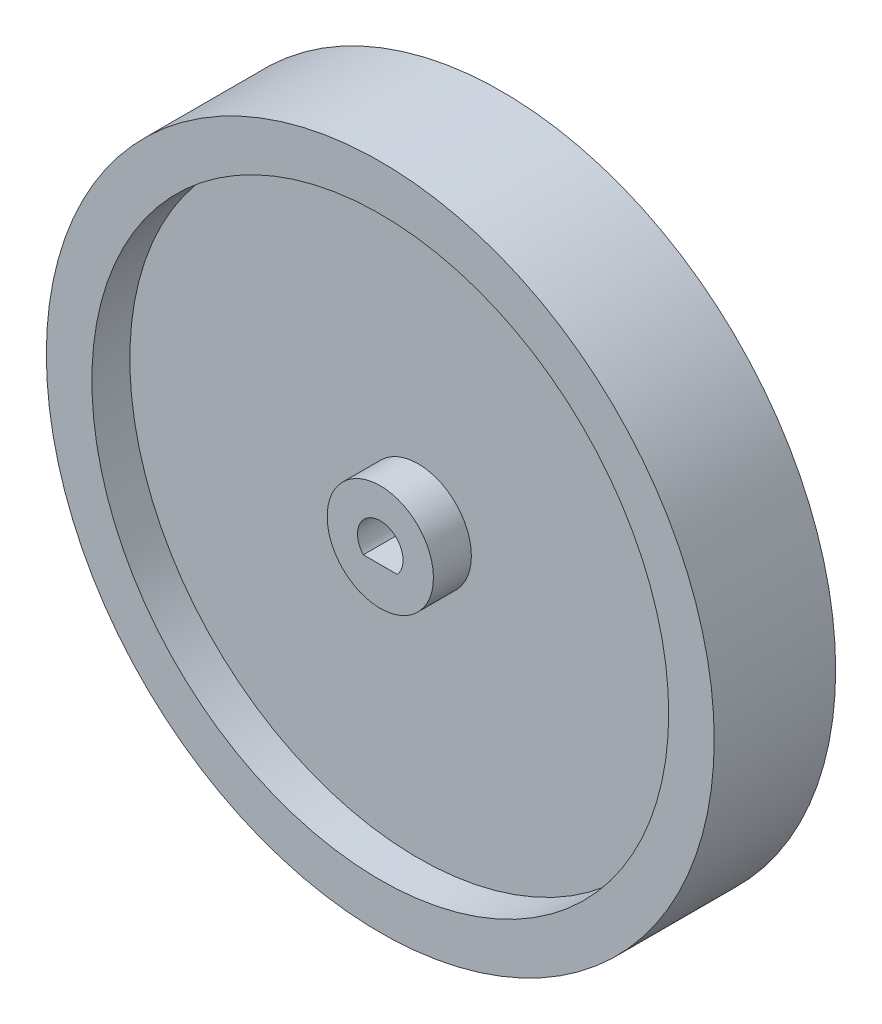
ISO-10303-21;
HEADER;
FILE_DESCRIPTION(('STEP AP214'),'2;1');
FILE_NAME('part.step','',(''),(''),'','','');
FILE_SCHEMA(('AUTOMOTIVE_DESIGN { 1 0 10303 214 1 1 1 1 }'));
ENDSEC;
DATA;
#1=APPLICATION_CONTEXT('core data for automotive mechanical design processes');
#2=APPLICATION_PROTOCOL_DEFINITION('international standard','automotive_design',2000,#1);
#3=PRODUCT_CONTEXT('',#1,'mechanical');
#4=PRODUCT('Part','Part','',(#3));
#5=PRODUCT_RELATED_PRODUCT_CATEGORY('part','',(#4));
#6=PRODUCT_DEFINITION_FORMATION('','',#4);
#7=PRODUCT_DEFINITION_CONTEXT('part definition',#1,'design');
#8=PRODUCT_DEFINITION('design','',#6,#7);
#9=PRODUCT_DEFINITION_SHAPE('','',#8);
#10=(LENGTH_UNIT() NAMED_UNIT(*) SI_UNIT(.MILLI.,.METRE.));
#11=(NAMED_UNIT(*) PLANE_ANGLE_UNIT() SI_UNIT($,.RADIAN.));
#12=(NAMED_UNIT(*) SI_UNIT($,.STERADIAN.) SOLID_ANGLE_UNIT());
#13=UNCERTAINTY_MEASURE_WITH_UNIT(LENGTH_MEASURE(1.E-05),#10,'distance_accuracy_value','');
#14=(GEOMETRIC_REPRESENTATION_CONTEXT(3) GLOBAL_UNCERTAINTY_ASSIGNED_CONTEXT((#13)) GLOBAL_UNIT_ASSIGNED_CONTEXT((#10,
#11,#12)) REPRESENTATION_CONTEXT('',''));
#15=CARTESIAN_POINT('',(0.,0.,0.));
#16=DIRECTION('',(0.,0.,1.));
#17=DIRECTION('',(1.,0.,0.));
#18=AXIS2_PLACEMENT_3D('',#15,#16,#17);
#19=CARTESIAN_POINT('',(0.,0.,-4.));
#20=DIRECTION('',(0.,0.,1.));
#21=DIRECTION('',(1.,0.,0.));
#22=AXIS2_PLACEMENT_3D('',#19,#20,#21);
#23=CYLINDRICAL_SURFACE('',#22,3.5);
#24=CARTESIAN_POINT('',(0.,0.,-4.));
#25=DIRECTION('',(0.,0.,1.));
#26=DIRECTION('',(1.,0.,0.));
#27=AXIS2_PLACEMENT_3D('',#24,#25,#26);
#28=CIRCLE('',#27,3.5);
#29=CARTESIAN_POINT('',(3.5,0.,-4.));
#30=VERTEX_POINT('',#29);
#31=EDGE_CURVE('E84',#30,#30,#28,.T.);
#32=ORIENTED_EDGE('',*,*,#31,.T.);
#33=EDGE_LOOP('',(#32));
#34=FACE_BOUND('',#33,.T.);
#35=CARTESIAN_POINT('',(0.,0.,-1.5));
#36=DIRECTION('',(0.,0.,1.));
#37=DIRECTION('',(1.,0.,0.));
#38=AXIS2_PLACEMENT_3D('',#35,#36,#37);
#39=CIRCLE('',#38,3.5);
#40=CARTESIAN_POINT('',(3.5,0.,-1.5));
#41=VERTEX_POINT('',#40);
#42=EDGE_CURVE('E269',#41,#41,#39,.T.);
#43=ORIENTED_EDGE('',*,*,#42,.F.);
#44=EDGE_LOOP('',(#43));
#45=FACE_BOUND('',#44,.T.);
#46=ADVANCED_FACE('F51',(#34,#45),#23,.T.);
#47=CARTESIAN_POINT('',(0.,0.,-4.));
#48=DIRECTION('',(0.,0.,1.));
#49=DIRECTION('',(1.,0.,0.));
#50=AXIS2_PLACEMENT_3D('',#47,#48,#49);
#51=CYLINDRICAL_SURFACE('',#50,1.5);
#52=DIRECTION('',(0.,0.,1.));
#53=VECTOR('',#52,1.);
#54=CARTESIAN_POINT('',(1.11803398874989,-1.,-4.));
#55=LINE('',#54,#53);
#56=CARTESIAN_POINT('',(1.11803398874989,-1.,-4.));
#57=VERTEX_POINT('',#56);
#58=CARTESIAN_POINT('',(1.11803398874989,-1.,4.));
#59=VERTEX_POINT('',#58);
#60=EDGE_CURVE('E77',#57,#59,#55,.T.);
#61=ORIENTED_EDGE('',*,*,#60,.T.);
#62=CARTESIAN_POINT('',(0.,0.,4.));
#63=DIRECTION('',(0.,0.,1.));
#64=DIRECTION('',(1.,0.,0.));
#65=AXIS2_PLACEMENT_3D('',#62,#63,#64);
#66=CIRCLE('',#65,1.5);
#67=CARTESIAN_POINT('',(-1.11803398874989,-1.,4.));
#68=VERTEX_POINT('',#67);
#69=EDGE_CURVE('E80',#59,#68,#66,.T.);
#70=ORIENTED_EDGE('',*,*,#69,.T.);
#71=DIRECTION('',(0.,0.,1.));
#72=VECTOR('',#71,1.);
#73=CARTESIAN_POINT('',(-1.11803398874989,-1.,-4.));
#74=LINE('',#73,#72);
#75=CARTESIAN_POINT('',(-1.11803398874989,-1.,-4.));
#76=VERTEX_POINT('',#75);
#77=EDGE_CURVE('E59',#76,#68,#74,.T.);
#78=ORIENTED_EDGE('',*,*,#77,.F.);
#79=CARTESIAN_POINT('',(0.,0.,-4.));
#80=DIRECTION('',(0.,0.,1.));
#81=DIRECTION('',(1.,0.,0.));
#82=AXIS2_PLACEMENT_3D('',#79,#80,#81);
#83=CIRCLE('',#82,1.5);
#84=EDGE_CURVE('E82',#57,#76,#83,.T.);
#85=ORIENTED_EDGE('',*,*,#84,.F.);
#86=EDGE_LOOP('',(#61,#70,#78,#85));
#87=FACE_BOUND('',#86,.T.);
#88=ADVANCED_FACE('F53',(#87),#51,.F.);
#89=CARTESIAN_POINT('',(0.,-1.,-4.));
#90=DIRECTION('',(0.,-1.,0.));
#91=DIRECTION('',(0.,0.,-1.));
#92=AXIS2_PLACEMENT_3D('',#89,#90,#91);
#93=PLANE('',#92);
#94=ORIENTED_EDGE('',*,*,#77,.T.);
#95=DIRECTION('',(1.,0.,0.));
#96=VECTOR('',#95,1.);
#97=CARTESIAN_POINT('',(0.,-1.,4.));
#98=LINE('',#97,#96);
#99=EDGE_CURVE('E88',#68,#59,#98,.T.);
#100=ORIENTED_EDGE('',*,*,#99,.T.);
#101=ORIENTED_EDGE('',*,*,#60,.F.);
#102=DIRECTION('',(1.,0.,0.));
#103=VECTOR('',#102,1.);
#104=CARTESIAN_POINT('',(0.,-1.,-4.));
#105=LINE('',#104,#103);
#106=EDGE_CURVE('E66',#76,#57,#105,.T.);
#107=ORIENTED_EDGE('',*,*,#106,.F.);
#108=EDGE_LOOP('',(#94,#100,#101,#107));
#109=FACE_BOUND('',#108,.T.);
#110=ADVANCED_FACE('F91',(#109),#93,.F.);
#111=CARTESIAN_POINT('',(0.,0.,1.5));
#112=DIRECTION('',(0.,0.,1.));
#113=DIRECTION('',(1.,0.,0.));
#114=AXIS2_PLACEMENT_3D('',#111,#112,#113);
#115=CIRCLE('',#114,3.5);
#116=CARTESIAN_POINT('',(3.5,0.,1.5));
#117=VERTEX_POINT('',#116);
#118=EDGE_CURVE('E12',#117,#117,#115,.F.);
#119=ORIENTED_EDGE('',*,*,#118,.F.);
#120=EDGE_LOOP('',(#119));
#121=FACE_BOUND('',#120,.T.);
#122=CARTESIAN_POINT('',(0.,0.,4.));
#123=DIRECTION('',(0.,0.,1.));
#124=DIRECTION('',(1.,0.,0.));
#125=AXIS2_PLACEMENT_3D('',#122,#123,#124);
#126=CIRCLE('',#125,3.5);
#127=CARTESIAN_POINT('',(3.5,0.,4.));
#128=VERTEX_POINT('',#127);
#129=EDGE_CURVE('E92',#128,#128,#126,.T.);
#130=ORIENTED_EDGE('',*,*,#129,.F.);
#131=EDGE_LOOP('',(#130));
#132=FACE_BOUND('',#131,.T.);
#133=ADVANCED_FACE('F108',(#121,#132),#23,.T.);
#134=CARTESIAN_POINT('',(0.,0.,-4.));
#135=DIRECTION('',(0.,0.,1.));
#136=DIRECTION('',(1.,0.,0.));
#137=AXIS2_PLACEMENT_3D('',#134,#135,#136);
#138=PLANE('',#137);
#139=ORIENTED_EDGE('',*,*,#84,.T.);
#140=ORIENTED_EDGE('',*,*,#106,.T.);
#141=EDGE_LOOP('',(#139,#140));
#142=FACE_BOUND('',#141,.T.);
#143=ORIENTED_EDGE('',*,*,#31,.F.);
#144=EDGE_LOOP('',(#143));
#145=FACE_BOUND('',#144,.T.);
#146=ADVANCED_FACE('F106',(#142,#145),#138,.F.);
#147=CARTESIAN_POINT('',(0.,0.,4.));
#148=DIRECTION('',(0.,0.,1.));
#149=DIRECTION('',(1.,0.,0.));
#150=AXIS2_PLACEMENT_3D('',#147,#148,#149);
#151=PLANE('',#150);
#152=ORIENTED_EDGE('',*,*,#69,.F.);
#153=ORIENTED_EDGE('',*,*,#99,.F.);
#154=EDGE_LOOP('',(#152,#153));
#155=FACE_BOUND('',#154,.T.);
#156=ORIENTED_EDGE('',*,*,#129,.T.);
#157=EDGE_LOOP('',(#156));
#158=FACE_BOUND('',#157,.T.);
#159=ADVANCED_FACE('F86',(#155,#158),#151,.T.);
#160=CARTESIAN_POINT('',(0.,0.,-1.5));
#161=DIRECTION('',(0.,0.,1.));
#162=DIRECTION('',(1.,0.,0.));
#163=AXIS2_PLACEMENT_3D('',#160,#161,#162);
#164=PLANE('',#163);
#165=ORIENTED_EDGE('',*,*,#42,.T.);
#166=EDGE_LOOP('',(#165));
#167=FACE_BOUND('',#166,.T.);
#168=CARTESIAN_POINT('',(0.,0.,-1.5));
#169=DIRECTION('',(0.,0.,1.));
#170=DIRECTION('',(1.,0.,0.));
#171=AXIS2_PLACEMENT_3D('',#168,#169,#170);
#172=CIRCLE('',#171,19.);
#173=CARTESIAN_POINT('',(19.,0.,-1.5));
#174=VERTEX_POINT('',#173);
#175=EDGE_CURVE('E89',#174,#174,#172,.T.);
#176=ORIENTED_EDGE('',*,*,#175,.F.);
#177=EDGE_LOOP('',(#176));
#178=FACE_BOUND('',#177,.T.);
#179=ADVANCED_FACE('F114',(#167,#178),#164,.F.);
#180=CARTESIAN_POINT('',(0.,0.,1.5));
#181=DIRECTION('',(0.,0.,1.));
#182=DIRECTION('',(1.,0.,0.));
#183=AXIS2_PLACEMENT_3D('',#180,#181,#182);
#184=PLANE('',#183);
#185=ORIENTED_EDGE('',*,*,#118,.T.);
#186=EDGE_LOOP('',(#185));
#187=FACE_BOUND('',#186,.T.);
#188=CARTESIAN_POINT('',(0.,0.,1.5));
#189=DIRECTION('',(0.,0.,1.));
#190=DIRECTION('',(1.,0.,0.));
#191=AXIS2_PLACEMENT_3D('',#188,#189,#190);
#192=CIRCLE('',#191,19.);
#193=CARTESIAN_POINT('',(19.,0.,1.5));
#194=VERTEX_POINT('',#193);
#195=EDGE_CURVE('E266',#194,#194,#192,.T.);
#196=ORIENTED_EDGE('',*,*,#195,.T.);
#197=EDGE_LOOP('',(#196));
#198=FACE_BOUND('',#197,.T.);
#199=ADVANCED_FACE('F145',(#187,#198),#184,.T.);
#200=CARTESIAN_POINT('',(0.,0.,-4.));
#201=DIRECTION('',(0.,0.,1.));
#202=DIRECTION('',(1.,0.,0.));
#203=AXIS2_PLACEMENT_3D('',#200,#201,#202);
#204=CYLINDRICAL_SURFACE('',#203,19.);
#205=CARTESIAN_POINT('',(0.,0.,-4.));
#206=DIRECTION('',(0.,0.,1.));
#207=DIRECTION('',(1.,0.,0.));
#208=AXIS2_PLACEMENT_3D('',#205,#206,#207);
#209=CIRCLE('',#208,19.);
#210=CARTESIAN_POINT('',(19.,0.,-4.));
#211=VERTEX_POINT('',#210);
#212=EDGE_CURVE('E257',#211,#211,#209,.T.);
#213=ORIENTED_EDGE('',*,*,#212,.F.);
#214=EDGE_LOOP('',(#213));
#215=FACE_BOUND('',#214,.T.);
#216=ORIENTED_EDGE('',*,*,#175,.T.);
#217=EDGE_LOOP('',(#216));
#218=FACE_BOUND('',#217,.T.);
#219=ADVANCED_FACE('F157',(#215,#218),#204,.F.);
#220=ORIENTED_EDGE('',*,*,#195,.F.);
#221=EDGE_LOOP('',(#220));
#222=FACE_BOUND('',#221,.T.);
#223=CARTESIAN_POINT('',(0.,0.,4.));
#224=DIRECTION('',(0.,0.,1.));
#225=DIRECTION('',(1.,0.,0.));
#226=AXIS2_PLACEMENT_3D('',#223,#224,#225);
#227=CIRCLE('',#226,19.);
#228=CARTESIAN_POINT('',(19.,0.,4.));
#229=VERTEX_POINT('',#228);
#230=EDGE_CURVE('E252',#229,#229,#227,.T.);
#231=ORIENTED_EDGE('',*,*,#230,.T.);
#232=EDGE_LOOP('',(#231));
#233=FACE_BOUND('',#232,.T.);
#234=ADVANCED_FACE('F168',(#222,#233),#204,.F.);
#235=CARTESIAN_POINT('',(0.,0.,-4.));
#236=DIRECTION('',(0.,0.,1.));
#237=DIRECTION('',(1.,0.,0.));
#238=AXIS2_PLACEMENT_3D('',#235,#236,#237);
#239=CYLINDRICAL_SURFACE('',#238,22.);
#240=CARTESIAN_POINT('',(0.,0.,-4.));
#241=DIRECTION('',(0.,0.,1.));
#242=DIRECTION('',(1.,0.,0.));
#243=AXIS2_PLACEMENT_3D('',#240,#241,#242);
#244=CIRCLE('',#243,22.);
#245=CARTESIAN_POINT('',(22.,0.,-4.));
#246=VERTEX_POINT('',#245);
#247=EDGE_CURVE('E260',#246,#246,#244,.T.);
#248=ORIENTED_EDGE('',*,*,#247,.T.);
#249=EDGE_LOOP('',(#248));
#250=FACE_BOUND('',#249,.T.);
#251=CARTESIAN_POINT('',(0.,0.,4.));
#252=DIRECTION('',(0.,0.,1.));
#253=DIRECTION('',(1.,0.,0.));
#254=AXIS2_PLACEMENT_3D('',#251,#252,#253);
#255=CIRCLE('',#254,22.);
#256=CARTESIAN_POINT('',(22.,0.,4.));
#257=VERTEX_POINT('',#256);
#258=EDGE_CURVE('E255',#257,#257,#255,.T.);
#259=ORIENTED_EDGE('',*,*,#258,.F.);
#260=EDGE_LOOP('',(#259));
#261=FACE_BOUND('',#260,.T.);
#262=ADVANCED_FACE('F179',(#250,#261),#239,.T.);
#263=CARTESIAN_POINT('',(0.,0.,-4.));
#264=DIRECTION('',(0.,0.,1.));
#265=DIRECTION('',(1.,0.,0.));
#266=AXIS2_PLACEMENT_3D('',#263,#264,#265);
#267=PLANE('',#266);
#268=ORIENTED_EDGE('',*,*,#212,.T.);
#269=EDGE_LOOP('',(#268));
#270=FACE_BOUND('',#269,.T.);
#271=ORIENTED_EDGE('',*,*,#247,.F.);
#272=EDGE_LOOP('',(#271));
#273=FACE_BOUND('',#272,.T.);
#274=ADVANCED_FACE('F188',(#270,#273),#267,.F.);
#275=CARTESIAN_POINT('',(0.,0.,4.));
#276=DIRECTION('',(0.,0.,1.));
#277=DIRECTION('',(1.,0.,0.));
#278=AXIS2_PLACEMENT_3D('',#275,#276,#277);
#279=PLANE('',#278);
#280=ORIENTED_EDGE('',*,*,#230,.F.);
#281=EDGE_LOOP('',(#280));
#282=FACE_BOUND('',#281,.T.);
#283=ORIENTED_EDGE('',*,*,#258,.T.);
#284=EDGE_LOOP('',(#283));
#285=FACE_BOUND('',#284,.T.);
#286=ADVANCED_FACE('F198',(#282,#285),#279,.T.);
#287=CLOSED_SHELL('',(#46,#88,#110,#133,#146,#159,#179,#199,#219,#234,#262,#274,#286));
#288=MANIFOLD_SOLID_BREP('B2',#287);
#289=ADVANCED_BREP_SHAPE_REPRESENTATION('',(#18,#288),#14);
#290=SHAPE_DEFINITION_REPRESENTATION(#9,#289);
ENDSEC;
END-ISO-10303-21;
